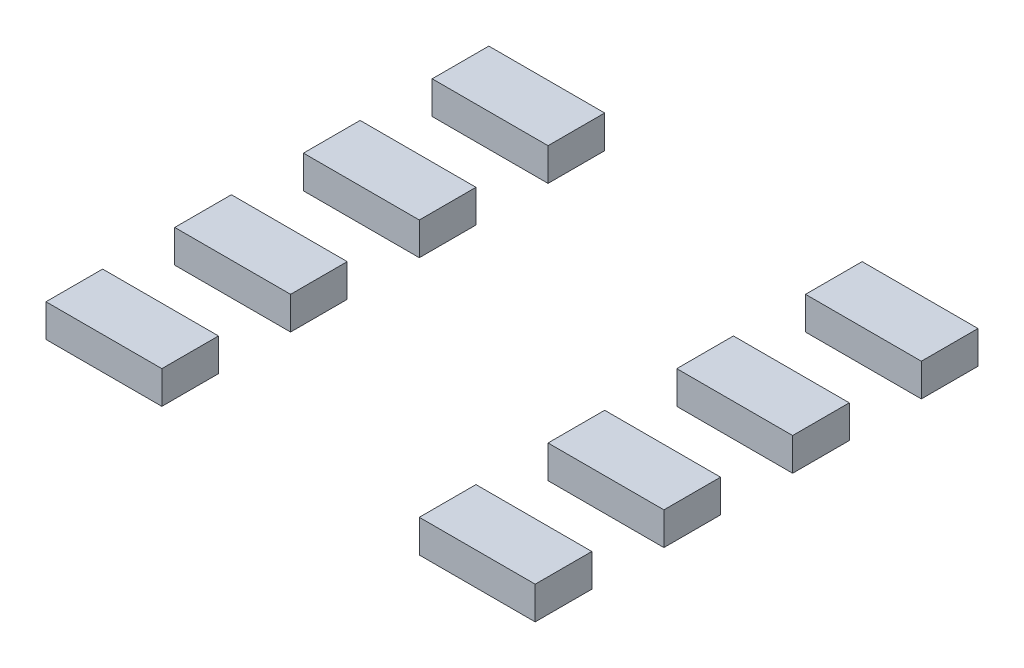
ISO-10303-21;
HEADER;
FILE_DESCRIPTION(('STEP AP214'),'2;1');
FILE_NAME('part.step','',(''),(''),'','','');
FILE_SCHEMA(('AUTOMOTIVE_DESIGN { 1 0 10303 214 1 1 1 1 }'));
ENDSEC;
DATA;
#1=APPLICATION_CONTEXT('core data for automotive mechanical design processes');
#2=APPLICATION_PROTOCOL_DEFINITION('international standard','automotive_design',2000,#1);
#3=PRODUCT_CONTEXT('',#1,'mechanical');
#4=PRODUCT('Part','Part','',(#3));
#5=PRODUCT_RELATED_PRODUCT_CATEGORY('part','',(#4));
#6=PRODUCT_DEFINITION_FORMATION('','',#4);
#7=PRODUCT_DEFINITION_CONTEXT('part definition',#1,'design');
#8=PRODUCT_DEFINITION('design','',#6,#7);
#9=PRODUCT_DEFINITION_SHAPE('','',#8);
#10=(LENGTH_UNIT() NAMED_UNIT(*) SI_UNIT(.MILLI.,.METRE.));
#11=(NAMED_UNIT(*) PLANE_ANGLE_UNIT() SI_UNIT($,.RADIAN.));
#12=(NAMED_UNIT(*) SI_UNIT($,.STERADIAN.) SOLID_ANGLE_UNIT());
#13=UNCERTAINTY_MEASURE_WITH_UNIT(LENGTH_MEASURE(1.E-05),#10,'distance_accuracy_value','');
#14=(GEOMETRIC_REPRESENTATION_CONTEXT(3) GLOBAL_UNCERTAINTY_ASSIGNED_CONTEXT((#13)) GLOBAL_UNIT_ASSIGNED_CONTEXT((#10,
#11,#12)) REPRESENTATION_CONTEXT('',''));
#15=CARTESIAN_POINT('',(0.,0.,0.));
#16=DIRECTION('',(0.,0.,1.));
#17=DIRECTION('',(1.,0.,0.));
#18=AXIS2_PLACEMENT_3D('',#15,#16,#17);
#19=CARTESIAN_POINT('',(0.,0.127,0.));
#20=DIRECTION('',(0.,1.,0.));
#21=DIRECTION('',(1.,0.,0.));
#22=AXIS2_PLACEMENT_3D('',#19,#20,#21);
#23=PLANE('',#22);
#24=DIRECTION('',(1.,0.,0.));
#25=VECTOR('',#24,1.);
#26=CARTESIAN_POINT('',(-0.95,0.127,-0.64));
#27=LINE('',#26,#25);
#28=CARTESIAN_POINT('',(-0.95,0.127,-0.64));
#29=VERTEX_POINT('',#28);
#30=CARTESIAN_POINT('',(-0.5,0.127,-0.64));
#31=VERTEX_POINT('',#30);
#32=EDGE_CURVE('P0_E11',#29,#31,#27,.T.);
#33=ORIENTED_EDGE('',*,*,#32,.T.);
#34=DIRECTION('',(0.,0.,-1.));
#35=VECTOR('',#34,1.);
#36=CARTESIAN_POINT('',(-0.5,0.127,-0.64));
#37=LINE('',#36,#35);
#38=CARTESIAN_POINT('',(-0.5,0.127,-0.86));
#39=VERTEX_POINT('',#38);
#40=EDGE_CURVE('P0_E81',#31,#39,#37,.T.);
#41=ORIENTED_EDGE('',*,*,#40,.T.);
#42=DIRECTION('',(-1.,0.,0.));
#43=VECTOR('',#42,1.);
#44=CARTESIAN_POINT('',(-0.5,0.127,-0.86));
#45=LINE('',#44,#43);
#46=CARTESIAN_POINT('',(-0.95,0.127,-0.86));
#47=VERTEX_POINT('',#46);
#48=EDGE_CURVE('P0_E78',#39,#47,#45,.T.);
#49=ORIENTED_EDGE('',*,*,#48,.T.);
#50=DIRECTION('',(0.,0.,1.));
#51=VECTOR('',#50,1.);
#52=CARTESIAN_POINT('',(-0.95,0.127,-0.86));
#53=LINE('',#52,#51);
#54=EDGE_CURVE('P0_E79',#47,#29,#53,.T.);
#55=ORIENTED_EDGE('',*,*,#54,.T.);
#56=EDGE_LOOP('',(#33,#41,#49,#55));
#57=FACE_BOUND('',#56,.T.);
#58=ADVANCED_FACE('P0_F18',(#57),#23,.T.);
#59=CARTESIAN_POINT('',(-0.95,0.,-0.64));
#60=DIRECTION('',(0.,0.,1.));
#61=DIRECTION('',(1.,0.,0.));
#62=AXIS2_PLACEMENT_3D('',#59,#60,#61);
#63=PLANE('',#62);
#64=DIRECTION('',(0.,1.,0.));
#65=VECTOR('',#64,1.);
#66=CARTESIAN_POINT('',(-0.5,0.,-0.64));
#67=LINE('',#66,#65);
#68=CARTESIAN_POINT('',(-0.5,0.,-0.64));
#69=VERTEX_POINT('',#68);
#70=EDGE_CURVE('P0_E27',#69,#31,#67,.T.);
#71=ORIENTED_EDGE('',*,*,#70,.T.);
#72=ORIENTED_EDGE('',*,*,#32,.F.);
#73=DIRECTION('',(0.,1.,0.));
#74=VECTOR('',#73,1.);
#75=CARTESIAN_POINT('',(-0.95,0.,-0.64));
#76=LINE('',#75,#74);
#77=CARTESIAN_POINT('',(-0.95,0.,-0.64));
#78=VERTEX_POINT('',#77);
#79=EDGE_CURVE('P0_E94',#78,#29,#76,.T.);
#80=ORIENTED_EDGE('',*,*,#79,.F.);
#81=DIRECTION('',(1.,0.,0.));
#82=VECTOR('',#81,1.);
#83=CARTESIAN_POINT('',(-0.95,0.,-0.64));
#84=LINE('',#83,#82);
#85=EDGE_CURVE('P0_E113',#78,#69,#84,.T.);
#86=ORIENTED_EDGE('',*,*,#85,.T.);
#87=EDGE_LOOP('',(#71,#72,#80,#86));
#88=FACE_BOUND('',#87,.T.);
#89=ADVANCED_FACE('P0_F119',(#88),#63,.T.);
#90=CARTESIAN_POINT('',(-0.5,0.,-0.64));
#91=DIRECTION('',(1.,0.,0.));
#92=DIRECTION('',(0.,1.,0.));
#93=AXIS2_PLACEMENT_3D('',#90,#91,#92);
#94=PLANE('',#93);
#95=DIRECTION('',(0.,1.,0.));
#96=VECTOR('',#95,1.);
#97=CARTESIAN_POINT('',(-0.5,0.,-0.86));
#98=LINE('',#97,#96);
#99=CARTESIAN_POINT('',(-0.5,0.,-0.86));
#100=VERTEX_POINT('',#99);
#101=EDGE_CURVE('P0_E85',#100,#39,#98,.T.);
#102=ORIENTED_EDGE('',*,*,#101,.T.);
#103=ORIENTED_EDGE('',*,*,#40,.F.);
#104=ORIENTED_EDGE('',*,*,#70,.F.);
#105=DIRECTION('',(0.,0.,-1.));
#106=VECTOR('',#105,1.);
#107=CARTESIAN_POINT('',(-0.5,0.,-0.64));
#108=LINE('',#107,#106);
#109=EDGE_CURVE('P0_E110',#69,#100,#108,.T.);
#110=ORIENTED_EDGE('',*,*,#109,.T.);
#111=EDGE_LOOP('',(#102,#103,#104,#110));
#112=FACE_BOUND('',#111,.T.);
#113=ADVANCED_FACE('P0_F122',(#112),#94,.T.);
#114=CARTESIAN_POINT('',(-0.5,0.,-0.86));
#115=DIRECTION('',(0.,0.,-1.));
#116=DIRECTION('',(0.,-1.,0.));
#117=AXIS2_PLACEMENT_3D('',#114,#115,#116);
#118=PLANE('',#117);
#119=DIRECTION('',(0.,1.,0.));
#120=VECTOR('',#119,1.);
#121=CARTESIAN_POINT('',(-0.95,0.,-0.86));
#122=LINE('',#121,#120);
#123=CARTESIAN_POINT('',(-0.95,0.,-0.86));
#124=VERTEX_POINT('',#123);
#125=EDGE_CURVE('P0_E65',#124,#47,#122,.T.);
#126=ORIENTED_EDGE('',*,*,#125,.T.);
#127=ORIENTED_EDGE('',*,*,#48,.F.);
#128=ORIENTED_EDGE('',*,*,#101,.F.);
#129=DIRECTION('',(-1.,0.,0.));
#130=VECTOR('',#129,1.);
#131=CARTESIAN_POINT('',(-0.5,0.,-0.86));
#132=LINE('',#131,#130);
#133=EDGE_CURVE('P0_E90',#100,#124,#132,.T.);
#134=ORIENTED_EDGE('',*,*,#133,.T.);
#135=EDGE_LOOP('',(#126,#127,#128,#134));
#136=FACE_BOUND('',#135,.T.);
#137=ADVANCED_FACE('P0_F88',(#136),#118,.T.);
#138=CARTESIAN_POINT('',(-0.95,0.,-0.86));
#139=DIRECTION('',(-1.,0.,0.));
#140=DIRECTION('',(0.,0.,1.));
#141=AXIS2_PLACEMENT_3D('',#138,#139,#140);
#142=PLANE('',#141);
#143=ORIENTED_EDGE('',*,*,#79,.T.);
#144=ORIENTED_EDGE('',*,*,#54,.F.);
#145=ORIENTED_EDGE('',*,*,#125,.F.);
#146=DIRECTION('',(0.,0.,1.));
#147=VECTOR('',#146,1.);
#148=CARTESIAN_POINT('',(-0.95,0.,-0.86));
#149=LINE('',#148,#147);
#150=EDGE_CURVE('P0_E100',#124,#78,#149,.T.);
#151=ORIENTED_EDGE('',*,*,#150,.T.);
#152=EDGE_LOOP('',(#143,#144,#145,#151));
#153=FACE_BOUND('',#152,.T.);
#154=ADVANCED_FACE('P0_F93',(#153),#142,.T.);
#155=CARTESIAN_POINT('',(0.,0.,0.));
#156=DIRECTION('',(0.,1.,0.));
#157=DIRECTION('',(1.,0.,0.));
#158=AXIS2_PLACEMENT_3D('',#155,#156,#157);
#159=PLANE('',#158);
#160=ORIENTED_EDGE('',*,*,#133,.F.);
#161=ORIENTED_EDGE('',*,*,#109,.F.);
#162=ORIENTED_EDGE('',*,*,#85,.F.);
#163=ORIENTED_EDGE('',*,*,#150,.F.);
#164=EDGE_LOOP('',(#160,#161,#162,#163));
#165=FACE_BOUND('',#164,.T.);
#166=ADVANCED_FACE('P0_F121',(#165),#159,.F.);
#167=CLOSED_SHELL('',(#58,#89,#113,#137,#154,#166));
#168=MANIFOLD_SOLID_BREP('P0_B1',#167);
#169=CARTESIAN_POINT('',(0.,0.127,0.));
#170=DIRECTION('',(0.,1.,0.));
#171=DIRECTION('',(1.,0.,0.));
#172=AXIS2_PLACEMENT_3D('',#169,#170,#171);
#173=PLANE('',#172);
#174=DIRECTION('',(1.,0.,0.));
#175=VECTOR('',#174,1.);
#176=CARTESIAN_POINT('',(-0.95,0.127,-0.14));
#177=LINE('',#176,#175);
#178=CARTESIAN_POINT('',(-0.95,0.127,-0.14));
#179=VERTEX_POINT('',#178);
#180=CARTESIAN_POINT('',(-0.5,0.127,-0.14));
#181=VERTEX_POINT('',#180);
#182=EDGE_CURVE('P1_E11',#179,#181,#177,.T.);
#183=ORIENTED_EDGE('',*,*,#182,.T.);
#184=DIRECTION('',(0.,0.,-1.));
#185=VECTOR('',#184,1.);
#186=CARTESIAN_POINT('',(-0.5,0.127,-0.14));
#187=LINE('',#186,#185);
#188=CARTESIAN_POINT('',(-0.5,0.127,-0.36));
#189=VERTEX_POINT('',#188);
#190=EDGE_CURVE('P1_E84',#181,#189,#187,.T.);
#191=ORIENTED_EDGE('',*,*,#190,.T.);
#192=DIRECTION('',(-1.,0.,0.));
#193=VECTOR('',#192,1.);
#194=CARTESIAN_POINT('',(-0.5,0.127,-0.36));
#195=LINE('',#194,#193);
#196=CARTESIAN_POINT('',(-0.95,0.127,-0.36));
#197=VERTEX_POINT('',#196);
#198=EDGE_CURVE('P1_E80',#189,#197,#195,.T.);
#199=ORIENTED_EDGE('',*,*,#198,.T.);
#200=DIRECTION('',(0.,0.,1.));
#201=VECTOR('',#200,1.);
#202=CARTESIAN_POINT('',(-0.95,0.127,-0.36));
#203=LINE('',#202,#201);
#204=EDGE_CURVE('P1_E109',#197,#179,#203,.T.);
#205=ORIENTED_EDGE('',*,*,#204,.T.);
#206=EDGE_LOOP('',(#183,#191,#199,#205));
#207=FACE_BOUND('',#206,.T.);
#208=ADVANCED_FACE('P1_F18',(#207),#173,.T.);
#209=CARTESIAN_POINT('',(-0.95,0.,-0.14));
#210=DIRECTION('',(0.,0.,1.));
#211=DIRECTION('',(1.,0.,0.));
#212=AXIS2_PLACEMENT_3D('',#209,#210,#211);
#213=PLANE('',#212);
#214=DIRECTION('',(0.,1.,0.));
#215=VECTOR('',#214,1.);
#216=CARTESIAN_POINT('',(-0.5,0.,-0.14));
#217=LINE('',#216,#215);
#218=CARTESIAN_POINT('',(-0.5,0.,-0.14));
#219=VERTEX_POINT('',#218);
#220=EDGE_CURVE('P1_E28',#219,#181,#217,.T.);
#221=ORIENTED_EDGE('',*,*,#220,.T.);
#222=ORIENTED_EDGE('',*,*,#182,.F.);
#223=DIRECTION('',(0.,1.,0.));
#224=VECTOR('',#223,1.);
#225=CARTESIAN_POINT('',(-0.95,0.,-0.14));
#226=LINE('',#225,#224);
#227=CARTESIAN_POINT('',(-0.95,0.,-0.14));
#228=VERTEX_POINT('',#227);
#229=EDGE_CURVE('P1_E56',#228,#179,#226,.T.);
#230=ORIENTED_EDGE('',*,*,#229,.F.);
#231=DIRECTION('',(1.,0.,0.));
#232=VECTOR('',#231,1.);
#233=CARTESIAN_POINT('',(-0.95,0.,-0.14));
#234=LINE('',#233,#232);
#235=EDGE_CURVE('P1_E90',#228,#219,#234,.T.);
#236=ORIENTED_EDGE('',*,*,#235,.T.);
#237=EDGE_LOOP('',(#221,#222,#230,#236));
#238=FACE_BOUND('',#237,.T.);
#239=ADVANCED_FACE('P1_F116',(#238),#213,.T.);
#240=CARTESIAN_POINT('',(-0.5,0.,-0.14));
#241=DIRECTION('',(1.,0.,0.));
#242=DIRECTION('',(0.,1.,0.));
#243=AXIS2_PLACEMENT_3D('',#240,#241,#242);
#244=PLANE('',#243);
#245=DIRECTION('',(0.,1.,0.));
#246=VECTOR('',#245,1.);
#247=CARTESIAN_POINT('',(-0.5,0.,-0.36));
#248=LINE('',#247,#246);
#249=CARTESIAN_POINT('',(-0.5,0.,-0.36));
#250=VERTEX_POINT('',#249);
#251=EDGE_CURVE('P1_E74',#250,#189,#248,.T.);
#252=ORIENTED_EDGE('',*,*,#251,.T.);
#253=ORIENTED_EDGE('',*,*,#190,.F.);
#254=ORIENTED_EDGE('',*,*,#220,.F.);
#255=DIRECTION('',(0.,0.,-1.));
#256=VECTOR('',#255,1.);
#257=CARTESIAN_POINT('',(-0.5,0.,-0.14));
#258=LINE('',#257,#256);
#259=EDGE_CURVE('P1_E86',#219,#250,#258,.T.);
#260=ORIENTED_EDGE('',*,*,#259,.T.);
#261=EDGE_LOOP('',(#252,#253,#254,#260));
#262=FACE_BOUND('',#261,.T.);
#263=ADVANCED_FACE('P1_F20',(#262),#244,.T.);
#264=CARTESIAN_POINT('',(-0.5,0.,-0.36));
#265=DIRECTION('',(0.,0.,-1.));
#266=DIRECTION('',(0.,-1.,0.));
#267=AXIS2_PLACEMENT_3D('',#264,#265,#266);
#268=PLANE('',#267);
#269=DIRECTION('',(0.,1.,0.));
#270=VECTOR('',#269,1.);
#271=CARTESIAN_POINT('',(-0.95,0.,-0.36));
#272=LINE('',#271,#270);
#273=CARTESIAN_POINT('',(-0.95,0.,-0.36));
#274=VERTEX_POINT('',#273);
#275=EDGE_CURVE('P1_E108',#274,#197,#272,.T.);
#276=ORIENTED_EDGE('',*,*,#275,.T.);
#277=ORIENTED_EDGE('',*,*,#198,.F.);
#278=ORIENTED_EDGE('',*,*,#251,.F.);
#279=DIRECTION('',(-1.,0.,0.));
#280=VECTOR('',#279,1.);
#281=CARTESIAN_POINT('',(-0.5,0.,-0.36));
#282=LINE('',#281,#280);
#283=EDGE_CURVE('P1_E79',#250,#274,#282,.T.);
#284=ORIENTED_EDGE('',*,*,#283,.T.);
#285=EDGE_LOOP('',(#276,#277,#278,#284));
#286=FACE_BOUND('',#285,.T.);
#287=ADVANCED_FACE('P1_F77',(#286),#268,.T.);
#288=CARTESIAN_POINT('',(-0.95,0.,-0.36));
#289=DIRECTION('',(-1.,0.,0.));
#290=DIRECTION('',(0.,0.,1.));
#291=AXIS2_PLACEMENT_3D('',#288,#289,#290);
#292=PLANE('',#291);
#293=ORIENTED_EDGE('',*,*,#229,.T.);
#294=ORIENTED_EDGE('',*,*,#204,.F.);
#295=ORIENTED_EDGE('',*,*,#275,.F.);
#296=DIRECTION('',(0.,0.,1.));
#297=VECTOR('',#296,1.);
#298=CARTESIAN_POINT('',(-0.95,0.,-0.36));
#299=LINE('',#298,#297);
#300=EDGE_CURVE('P1_E94',#274,#228,#299,.T.);
#301=ORIENTED_EDGE('',*,*,#300,.T.);
#302=EDGE_LOOP('',(#293,#294,#295,#301));
#303=FACE_BOUND('',#302,.T.);
#304=ADVANCED_FACE('P1_F120',(#303),#292,.T.);
#305=CARTESIAN_POINT('',(0.,0.,0.));
#306=DIRECTION('',(0.,1.,0.));
#307=DIRECTION('',(1.,0.,0.));
#308=AXIS2_PLACEMENT_3D('',#305,#306,#307);
#309=PLANE('',#308);
#310=ORIENTED_EDGE('',*,*,#283,.F.);
#311=ORIENTED_EDGE('',*,*,#259,.F.);
#312=ORIENTED_EDGE('',*,*,#235,.F.);
#313=ORIENTED_EDGE('',*,*,#300,.F.);
#314=EDGE_LOOP('',(#310,#311,#312,#313));
#315=FACE_BOUND('',#314,.T.);
#316=ADVANCED_FACE('P1_F93',(#315),#309,.F.);
#317=CLOSED_SHELL('',(#208,#239,#263,#287,#304,#316));
#318=MANIFOLD_SOLID_BREP('P1_B1',#317);
#319=CARTESIAN_POINT('',(0.,0.127,0.));
#320=DIRECTION('',(0.,1.,0.));
#321=DIRECTION('',(1.,0.,0.));
#322=AXIS2_PLACEMENT_3D('',#319,#320,#321);
#323=PLANE('',#322);
#324=DIRECTION('',(1.,0.,0.));
#325=VECTOR('',#324,1.);
#326=CARTESIAN_POINT('',(-0.95,0.127,0.36));
#327=LINE('',#326,#325);
#328=CARTESIAN_POINT('',(-0.95,0.127,0.36));
#329=VERTEX_POINT('',#328);
#330=CARTESIAN_POINT('',(-0.5,0.127,0.36));
#331=VERTEX_POINT('',#330);
#332=EDGE_CURVE('P2_E11',#329,#331,#327,.T.);
#333=ORIENTED_EDGE('',*,*,#332,.T.);
#334=DIRECTION('',(0.,0.,-1.));
#335=VECTOR('',#334,1.);
#336=CARTESIAN_POINT('',(-0.5,0.127,0.36));
#337=LINE('',#336,#335);
#338=CARTESIAN_POINT('',(-0.5,0.127,0.14));
#339=VERTEX_POINT('',#338);
#340=EDGE_CURVE('P2_E102',#331,#339,#337,.T.);
#341=ORIENTED_EDGE('',*,*,#340,.T.);
#342=DIRECTION('',(-1.,0.,0.));
#343=VECTOR('',#342,1.);
#344=CARTESIAN_POINT('',(-0.5,0.127,0.14));
#345=LINE('',#344,#343);
#346=CARTESIAN_POINT('',(-0.95,0.127,0.14));
#347=VERTEX_POINT('',#346);
#348=EDGE_CURVE('P2_E80',#339,#347,#345,.T.);
#349=ORIENTED_EDGE('',*,*,#348,.T.);
#350=DIRECTION('',(0.,0.,1.));
#351=VECTOR('',#350,1.);
#352=CARTESIAN_POINT('',(-0.95,0.127,0.14));
#353=LINE('',#352,#351);
#354=EDGE_CURVE('P2_E78',#347,#329,#353,.T.);
#355=ORIENTED_EDGE('',*,*,#354,.T.);
#356=EDGE_LOOP('',(#333,#341,#349,#355));
#357=FACE_BOUND('',#356,.T.);
#358=ADVANCED_FACE('P2_F18',(#357),#323,.T.);
#359=CARTESIAN_POINT('',(-0.95,0.,0.36));
#360=DIRECTION('',(0.,0.,1.));
#361=DIRECTION('',(1.,0.,0.));
#362=AXIS2_PLACEMENT_3D('',#359,#360,#361);
#363=PLANE('',#362);
#364=DIRECTION('',(0.,1.,0.));
#365=VECTOR('',#364,1.);
#366=CARTESIAN_POINT('',(-0.5,0.,0.36));
#367=LINE('',#366,#365);
#368=CARTESIAN_POINT('',(-0.5,0.,0.36));
#369=VERTEX_POINT('',#368);
#370=EDGE_CURVE('P2_E28',#369,#331,#367,.T.);
#371=ORIENTED_EDGE('',*,*,#370,.T.);
#372=ORIENTED_EDGE('',*,*,#332,.F.);
#373=DIRECTION('',(0.,1.,0.));
#374=VECTOR('',#373,1.);
#375=CARTESIAN_POINT('',(-0.95,0.,0.36));
#376=LINE('',#375,#374);
#377=CARTESIAN_POINT('',(-0.95,0.,0.36));
#378=VERTEX_POINT('',#377);
#379=EDGE_CURVE('P2_E89',#378,#329,#376,.T.);
#380=ORIENTED_EDGE('',*,*,#379,.F.);
#381=DIRECTION('',(1.,0.,0.));
#382=VECTOR('',#381,1.);
#383=CARTESIAN_POINT('',(-0.95,0.,0.36));
#384=LINE('',#383,#382);
#385=EDGE_CURVE('P2_E87',#378,#369,#384,.T.);
#386=ORIENTED_EDGE('',*,*,#385,.T.);
#387=EDGE_LOOP('',(#371,#372,#380,#386));
#388=FACE_BOUND('',#387,.T.);
#389=ADVANCED_FACE('P2_F118',(#388),#363,.T.);
#390=CARTESIAN_POINT('',(-0.5,0.,0.36));
#391=DIRECTION('',(1.,0.,0.));
#392=DIRECTION('',(0.,1.,0.));
#393=AXIS2_PLACEMENT_3D('',#390,#391,#392);
#394=PLANE('',#393);
#395=DIRECTION('',(0.,1.,0.));
#396=VECTOR('',#395,1.);
#397=CARTESIAN_POINT('',(-0.5,0.,0.14));
#398=LINE('',#397,#396);
#399=CARTESIAN_POINT('',(-0.5,0.,0.14));
#400=VERTEX_POINT('',#399);
#401=EDGE_CURVE('P2_E63',#400,#339,#398,.T.);
#402=ORIENTED_EDGE('',*,*,#401,.T.);
#403=ORIENTED_EDGE('',*,*,#340,.F.);
#404=ORIENTED_EDGE('',*,*,#370,.F.);
#405=DIRECTION('',(0.,0.,-1.));
#406=VECTOR('',#405,1.);
#407=CARTESIAN_POINT('',(-0.5,0.,0.36));
#408=LINE('',#407,#406);
#409=EDGE_CURVE('P2_E93',#369,#400,#408,.T.);
#410=ORIENTED_EDGE('',*,*,#409,.T.);
#411=EDGE_LOOP('',(#402,#403,#404,#410));
#412=FACE_BOUND('',#411,.T.);
#413=ADVANCED_FACE('P2_F115',(#412),#394,.T.);
#414=CARTESIAN_POINT('',(-0.5,0.,0.14));
#415=DIRECTION('',(0.,0.,-1.));
#416=DIRECTION('',(0.,-1.,0.));
#417=AXIS2_PLACEMENT_3D('',#414,#415,#416);
#418=PLANE('',#417);
#419=DIRECTION('',(0.,1.,0.));
#420=VECTOR('',#419,1.);
#421=CARTESIAN_POINT('',(-0.95,0.,0.14));
#422=LINE('',#421,#420);
#423=CARTESIAN_POINT('',(-0.95,0.,0.14));
#424=VERTEX_POINT('',#423);
#425=EDGE_CURVE('P2_E21',#424,#347,#422,.T.);
#426=ORIENTED_EDGE('',*,*,#425,.T.);
#427=ORIENTED_EDGE('',*,*,#348,.F.);
#428=ORIENTED_EDGE('',*,*,#401,.F.);
#429=DIRECTION('',(-1.,0.,0.));
#430=VECTOR('',#429,1.);
#431=CARTESIAN_POINT('',(-0.5,0.,0.14));
#432=LINE('',#431,#430);
#433=EDGE_CURVE('P2_E85',#400,#424,#432,.T.);
#434=ORIENTED_EDGE('',*,*,#433,.T.);
#435=EDGE_LOOP('',(#426,#427,#428,#434));
#436=FACE_BOUND('',#435,.T.);
#437=ADVANCED_FACE('P2_F91',(#436),#418,.T.);
#438=CARTESIAN_POINT('',(-0.95,0.,0.14));
#439=DIRECTION('',(-1.,0.,0.));
#440=DIRECTION('',(0.,0.,1.));
#441=AXIS2_PLACEMENT_3D('',#438,#439,#440);
#442=PLANE('',#441);
#443=ORIENTED_EDGE('',*,*,#379,.T.);
#444=ORIENTED_EDGE('',*,*,#354,.F.);
#445=ORIENTED_EDGE('',*,*,#425,.F.);
#446=DIRECTION('',(0.,0.,1.));
#447=VECTOR('',#446,1.);
#448=CARTESIAN_POINT('',(-0.95,0.,0.14));
#449=LINE('',#448,#447);
#450=EDGE_CURVE('P2_E76',#424,#378,#449,.T.);
#451=ORIENTED_EDGE('',*,*,#450,.T.);
#452=EDGE_LOOP('',(#443,#444,#445,#451));
#453=FACE_BOUND('',#452,.T.);
#454=ADVANCED_FACE('P2_F75',(#453),#442,.T.);
#455=CARTESIAN_POINT('',(0.,0.,0.));
#456=DIRECTION('',(0.,1.,0.));
#457=DIRECTION('',(1.,0.,0.));
#458=AXIS2_PLACEMENT_3D('',#455,#456,#457);
#459=PLANE('',#458);
#460=ORIENTED_EDGE('',*,*,#433,.F.);
#461=ORIENTED_EDGE('',*,*,#409,.F.);
#462=ORIENTED_EDGE('',*,*,#385,.F.);
#463=ORIENTED_EDGE('',*,*,#450,.F.);
#464=EDGE_LOOP('',(#460,#461,#462,#463));
#465=FACE_BOUND('',#464,.T.);
#466=ADVANCED_FACE('P2_F83',(#465),#459,.F.);
#467=CLOSED_SHELL('',(#358,#389,#413,#437,#454,#466));
#468=MANIFOLD_SOLID_BREP('P2_B1',#467);
#469=CARTESIAN_POINT('',(0.,0.127,0.));
#470=DIRECTION('',(0.,1.,0.));
#471=DIRECTION('',(1.,0.,0.));
#472=AXIS2_PLACEMENT_3D('',#469,#470,#471);
#473=PLANE('',#472);
#474=DIRECTION('',(1.,0.,0.));
#475=VECTOR('',#474,1.);
#476=CARTESIAN_POINT('',(-0.95,0.127,0.86));
#477=LINE('',#476,#475);
#478=CARTESIAN_POINT('',(-0.95,0.127,0.86));
#479=VERTEX_POINT('',#478);
#480=CARTESIAN_POINT('',(-0.5,0.127,0.86));
#481=VERTEX_POINT('',#480);
#482=EDGE_CURVE('P3_E11',#479,#481,#477,.T.);
#483=ORIENTED_EDGE('',*,*,#482,.T.);
#484=DIRECTION('',(0.,0.,-1.));
#485=VECTOR('',#484,1.);
#486=CARTESIAN_POINT('',(-0.5,0.127,0.86));
#487=LINE('',#486,#485);
#488=CARTESIAN_POINT('',(-0.5,0.127,0.64));
#489=VERTEX_POINT('',#488);
#490=EDGE_CURVE('P3_E48',#481,#489,#487,.T.);
#491=ORIENTED_EDGE('',*,*,#490,.T.);
#492=DIRECTION('',(-1.,0.,0.));
#493=VECTOR('',#492,1.);
#494=CARTESIAN_POINT('',(-0.5,0.127,0.64));
#495=LINE('',#494,#493);
#496=CARTESIAN_POINT('',(-0.95,0.127,0.64));
#497=VERTEX_POINT('',#496);
#498=EDGE_CURVE('P3_E89',#489,#497,#495,.T.);
#499=ORIENTED_EDGE('',*,*,#498,.T.);
#500=DIRECTION('',(0.,0.,1.));
#501=VECTOR('',#500,1.);
#502=CARTESIAN_POINT('',(-0.95,0.127,0.64));
#503=LINE('',#502,#501);
#504=EDGE_CURVE('P3_E88',#497,#479,#503,.T.);
#505=ORIENTED_EDGE('',*,*,#504,.T.);
#506=EDGE_LOOP('',(#483,#491,#499,#505));
#507=FACE_BOUND('',#506,.T.);
#508=ADVANCED_FACE('P3_F18',(#507),#473,.T.);
#509=CARTESIAN_POINT('',(-0.95,0.,0.86));
#510=DIRECTION('',(0.,0.,1.));
#511=DIRECTION('',(1.,0.,0.));
#512=AXIS2_PLACEMENT_3D('',#509,#510,#511);
#513=PLANE('',#512);
#514=DIRECTION('',(0.,1.,0.));
#515=VECTOR('',#514,1.);
#516=CARTESIAN_POINT('',(-0.5,0.,0.86));
#517=LINE('',#516,#515);
#518=CARTESIAN_POINT('',(-0.5,0.,0.86));
#519=VERTEX_POINT('',#518);
#520=EDGE_CURVE('P3_E28',#519,#481,#517,.T.);
#521=ORIENTED_EDGE('',*,*,#520,.T.);
#522=ORIENTED_EDGE('',*,*,#482,.F.);
#523=DIRECTION('',(0.,1.,0.));
#524=VECTOR('',#523,1.);
#525=CARTESIAN_POINT('',(-0.95,0.,0.86));
#526=LINE('',#525,#524);
#527=CARTESIAN_POINT('',(-0.95,0.,0.86));
#528=VERTEX_POINT('',#527);
#529=EDGE_CURVE('P3_E86',#528,#479,#526,.T.);
#530=ORIENTED_EDGE('',*,*,#529,.F.);
#531=DIRECTION('',(1.,0.,0.));
#532=VECTOR('',#531,1.);
#533=CARTESIAN_POINT('',(-0.95,0.,0.86));
#534=LINE('',#533,#532);
#535=EDGE_CURVE('P3_E22',#528,#519,#534,.T.);
#536=ORIENTED_EDGE('',*,*,#535,.T.);
#537=EDGE_LOOP('',(#521,#522,#530,#536));
#538=FACE_BOUND('',#537,.T.);
#539=ADVANCED_FACE('P3_F20',(#538),#513,.T.);
#540=CARTESIAN_POINT('',(-0.5,0.,0.86));
#541=DIRECTION('',(1.,0.,0.));
#542=DIRECTION('',(0.,1.,0.));
#543=AXIS2_PLACEMENT_3D('',#540,#541,#542);
#544=PLANE('',#543);
#545=DIRECTION('',(0.,1.,0.));
#546=VECTOR('',#545,1.);
#547=CARTESIAN_POINT('',(-0.5,0.,0.64));
#548=LINE('',#547,#546);
#549=CARTESIAN_POINT('',(-0.5,0.,0.64));
#550=VERTEX_POINT('',#549);
#551=EDGE_CURVE('P3_E61',#550,#489,#548,.T.);
#552=ORIENTED_EDGE('',*,*,#551,.T.);
#553=ORIENTED_EDGE('',*,*,#490,.F.);
#554=ORIENTED_EDGE('',*,*,#520,.F.);
#555=DIRECTION('',(0.,0.,-1.));
#556=VECTOR('',#555,1.);
#557=CARTESIAN_POINT('',(-0.5,0.,0.86));
#558=LINE('',#557,#556);
#559=EDGE_CURVE('P3_E111',#519,#550,#558,.T.);
#560=ORIENTED_EDGE('',*,*,#559,.T.);
#561=EDGE_LOOP('',(#552,#553,#554,#560));
#562=FACE_BOUND('',#561,.T.);
#563=ADVANCED_FACE('P3_F132',(#562),#544,.T.);
#564=CARTESIAN_POINT('',(-0.5,0.,0.64));
#565=DIRECTION('',(0.,0.,-1.));
#566=DIRECTION('',(0.,-1.,0.));
#567=AXIS2_PLACEMENT_3D('',#564,#565,#566);
#568=PLANE('',#567);
#569=DIRECTION('',(0.,1.,0.));
#570=VECTOR('',#569,1.);
#571=CARTESIAN_POINT('',(-0.95,0.,0.64));
#572=LINE('',#571,#570);
#573=CARTESIAN_POINT('',(-0.95,0.,0.64));
#574=VERTEX_POINT('',#573);
#575=EDGE_CURVE('P3_E74',#574,#497,#572,.T.);
#576=ORIENTED_EDGE('',*,*,#575,.T.);
#577=ORIENTED_EDGE('',*,*,#498,.F.);
#578=ORIENTED_EDGE('',*,*,#551,.F.);
#579=DIRECTION('',(-1.,0.,0.));
#580=VECTOR('',#579,1.);
#581=CARTESIAN_POINT('',(-0.5,0.,0.64));
#582=LINE('',#581,#580);
#583=EDGE_CURVE('P3_E114',#550,#574,#582,.T.);
#584=ORIENTED_EDGE('',*,*,#583,.T.);
#585=EDGE_LOOP('',(#576,#577,#578,#584));
#586=FACE_BOUND('',#585,.T.);
#587=ADVANCED_FACE('P3_F120',(#586),#568,.T.);
#588=CARTESIAN_POINT('',(-0.95,0.,0.64));
#589=DIRECTION('',(-1.,0.,0.));
#590=DIRECTION('',(0.,0.,1.));
#591=AXIS2_PLACEMENT_3D('',#588,#589,#590);
#592=PLANE('',#591);
#593=ORIENTED_EDGE('',*,*,#529,.T.);
#594=ORIENTED_EDGE('',*,*,#504,.F.);
#595=ORIENTED_EDGE('',*,*,#575,.F.);
#596=DIRECTION('',(0.,0.,1.));
#597=VECTOR('',#596,1.);
#598=CARTESIAN_POINT('',(-0.95,0.,0.64));
#599=LINE('',#598,#597);
#600=EDGE_CURVE('P3_E93',#574,#528,#599,.T.);
#601=ORIENTED_EDGE('',*,*,#600,.T.);
#602=EDGE_LOOP('',(#593,#594,#595,#601));
#603=FACE_BOUND('',#602,.T.);
#604=ADVANCED_FACE('P3_F92',(#603),#592,.T.);
#605=CARTESIAN_POINT('',(0.,0.,0.));
#606=DIRECTION('',(0.,1.,0.));
#607=DIRECTION('',(1.,0.,0.));
#608=AXIS2_PLACEMENT_3D('',#605,#606,#607);
#609=PLANE('',#608);
#610=ORIENTED_EDGE('',*,*,#583,.F.);
#611=ORIENTED_EDGE('',*,*,#559,.F.);
#612=ORIENTED_EDGE('',*,*,#535,.F.);
#613=ORIENTED_EDGE('',*,*,#600,.F.);
#614=EDGE_LOOP('',(#610,#611,#612,#613));
#615=FACE_BOUND('',#614,.T.);
#616=ADVANCED_FACE('P3_F123',(#615),#609,.F.);
#617=CLOSED_SHELL('',(#508,#539,#563,#587,#604,#616));
#618=MANIFOLD_SOLID_BREP('P3_B1',#617);
#619=CARTESIAN_POINT('',(0.,0.127,0.));
#620=DIRECTION('',(0.,-1.,0.));
#621=DIRECTION('',(0.,0.,-1.));
#622=AXIS2_PLACEMENT_3D('',#619,#620,#621);
#623=PLANE('',#622);
#624=DIRECTION('',(1.,0.,0.));
#625=VECTOR('',#624,1.);
#626=CARTESIAN_POINT('',(0.5,0.127,-0.86));
#627=LINE('',#626,#625);
#628=CARTESIAN_POINT('',(0.5,0.127,-0.86));
#629=VERTEX_POINT('',#628);
#630=CARTESIAN_POINT('',(0.95,0.127,-0.86));
#631=VERTEX_POINT('',#630);
#632=EDGE_CURVE('P4_E11',#629,#631,#627,.T.);
#633=ORIENTED_EDGE('',*,*,#632,.F.);
#634=DIRECTION('',(0.,0.,-1.));
#635=VECTOR('',#634,1.);
#636=CARTESIAN_POINT('',(0.5,0.127,-0.64));
#637=LINE('',#636,#635);
#638=CARTESIAN_POINT('',(0.5,0.127,-0.64));
#639=VERTEX_POINT('',#638);
#640=EDGE_CURVE('P4_E73',#639,#629,#637,.T.);
#641=ORIENTED_EDGE('',*,*,#640,.F.);
#642=DIRECTION('',(-1.,0.,0.));
#643=VECTOR('',#642,1.);
#644=CARTESIAN_POINT('',(0.95,0.127,-0.64));
#645=LINE('',#644,#643);
#646=CARTESIAN_POINT('',(0.95,0.127,-0.64));
#647=VERTEX_POINT('',#646);
#648=EDGE_CURVE('P4_E107',#647,#639,#645,.T.);
#649=ORIENTED_EDGE('',*,*,#648,.F.);
#650=DIRECTION('',(0.,0.,1.));
#651=VECTOR('',#650,1.);
#652=CARTESIAN_POINT('',(0.95,0.127,-0.86));
#653=LINE('',#652,#651);
#654=EDGE_CURVE('P4_E99',#631,#647,#653,.T.);
#655=ORIENTED_EDGE('',*,*,#654,.F.);
#656=EDGE_LOOP('',(#633,#641,#649,#655));
#657=FACE_BOUND('',#656,.T.);
#658=ADVANCED_FACE('P4_F18',(#657),#623,.F.);
#659=CARTESIAN_POINT('',(0.5,0.,-0.86));
#660=DIRECTION('',(0.,0.,1.));
#661=DIRECTION('',(1.,0.,0.));
#662=AXIS2_PLACEMENT_3D('',#659,#660,#661);
#663=PLANE('',#662);
#664=DIRECTION('',(0.,1.,0.));
#665=VECTOR('',#664,1.);
#666=CARTESIAN_POINT('',(0.5,0.,-0.86));
#667=LINE('',#666,#665);
#668=CARTESIAN_POINT('',(0.5,0.,-0.86));
#669=VERTEX_POINT('',#668);
#670=EDGE_CURVE('P4_E29',#669,#629,#667,.T.);
#671=ORIENTED_EDGE('',*,*,#670,.T.);
#672=ORIENTED_EDGE('',*,*,#632,.T.);
#673=DIRECTION('',(0.,1.,0.));
#674=VECTOR('',#673,1.);
#675=CARTESIAN_POINT('',(0.95,0.,-0.86));
#676=LINE('',#675,#674);
#677=CARTESIAN_POINT('',(0.95,0.,-0.86));
#678=VERTEX_POINT('',#677);
#679=EDGE_CURVE('P4_E81',#678,#631,#676,.T.);
#680=ORIENTED_EDGE('',*,*,#679,.F.);
#681=DIRECTION('',(1.,0.,0.));
#682=VECTOR('',#681,1.);
#683=CARTESIAN_POINT('',(0.5,0.,-0.86));
#684=LINE('',#683,#682);
#685=EDGE_CURVE('P4_E78',#669,#678,#684,.T.);
#686=ORIENTED_EDGE('',*,*,#685,.F.);
#687=EDGE_LOOP('',(#671,#672,#680,#686));
#688=FACE_BOUND('',#687,.T.);
#689=ADVANCED_FACE('P4_F79',(#688),#663,.F.);
#690=CARTESIAN_POINT('',(0.5,0.,-0.64));
#691=DIRECTION('',(1.,0.,0.));
#692=DIRECTION('',(0.,1.,0.));
#693=AXIS2_PLACEMENT_3D('',#690,#691,#692);
#694=PLANE('',#693);
#695=DIRECTION('',(0.,1.,0.));
#696=VECTOR('',#695,1.);
#697=CARTESIAN_POINT('',(0.5,0.,-0.64));
#698=LINE('',#697,#696);
#699=CARTESIAN_POINT('',(0.5,0.,-0.64));
#700=VERTEX_POINT('',#699);
#701=EDGE_CURVE('P4_E105',#700,#639,#698,.T.);
#702=ORIENTED_EDGE('',*,*,#701,.T.);
#703=ORIENTED_EDGE('',*,*,#640,.T.);
#704=ORIENTED_EDGE('',*,*,#670,.F.);
#705=DIRECTION('',(0.,0.,-1.));
#706=VECTOR('',#705,1.);
#707=CARTESIAN_POINT('',(0.5,0.,-0.64));
#708=LINE('',#707,#706);
#709=EDGE_CURVE('P4_E71',#700,#669,#708,.T.);
#710=ORIENTED_EDGE('',*,*,#709,.F.);
#711=EDGE_LOOP('',(#702,#703,#704,#710));
#712=FACE_BOUND('',#711,.T.);
#713=ADVANCED_FACE('P4_F69',(#712),#694,.F.);
#714=CARTESIAN_POINT('',(0.95,0.,-0.64));
#715=DIRECTION('',(0.,0.,-1.));
#716=DIRECTION('',(0.,-1.,0.));
#717=AXIS2_PLACEMENT_3D('',#714,#715,#716);
#718=PLANE('',#717);
#719=DIRECTION('',(0.,1.,0.));
#720=VECTOR('',#719,1.);
#721=CARTESIAN_POINT('',(0.95,0.,-0.64));
#722=LINE('',#721,#720);
#723=CARTESIAN_POINT('',(0.95,0.,-0.64));
#724=VERTEX_POINT('',#723);
#725=EDGE_CURVE('P4_E97',#724,#647,#722,.T.);
#726=ORIENTED_EDGE('',*,*,#725,.T.);
#727=ORIENTED_EDGE('',*,*,#648,.T.);
#728=ORIENTED_EDGE('',*,*,#701,.F.);
#729=DIRECTION('',(-1.,0.,0.));
#730=VECTOR('',#729,1.);
#731=CARTESIAN_POINT('',(0.95,0.,-0.64));
#732=LINE('',#731,#730);
#733=EDGE_CURVE('P4_E22',#724,#700,#732,.T.);
#734=ORIENTED_EDGE('',*,*,#733,.F.);
#735=EDGE_LOOP('',(#726,#727,#728,#734));
#736=FACE_BOUND('',#735,.T.);
#737=ADVANCED_FACE('P4_F115',(#736),#718,.F.);
#738=CARTESIAN_POINT('',(0.95,0.,-0.86));
#739=DIRECTION('',(-1.,0.,0.));
#740=DIRECTION('',(0.,0.,1.));
#741=AXIS2_PLACEMENT_3D('',#738,#739,#740);
#742=PLANE('',#741);
#743=ORIENTED_EDGE('',*,*,#679,.T.);
#744=ORIENTED_EDGE('',*,*,#654,.T.);
#745=ORIENTED_EDGE('',*,*,#725,.F.);
#746=DIRECTION('',(0.,0.,1.));
#747=VECTOR('',#746,1.);
#748=CARTESIAN_POINT('',(0.95,0.,-0.86));
#749=LINE('',#748,#747);
#750=EDGE_CURVE('P4_E86',#678,#724,#749,.T.);
#751=ORIENTED_EDGE('',*,*,#750,.F.);
#752=EDGE_LOOP('',(#743,#744,#745,#751));
#753=FACE_BOUND('',#752,.T.);
#754=ADVANCED_FACE('P4_F117',(#753),#742,.F.);
#755=CARTESIAN_POINT('',(0.,0.,0.));
#756=DIRECTION('',(0.,-1.,0.));
#757=DIRECTION('',(0.,0.,-1.));
#758=AXIS2_PLACEMENT_3D('',#755,#756,#757);
#759=PLANE('',#758);
#760=ORIENTED_EDGE('',*,*,#733,.T.);
#761=ORIENTED_EDGE('',*,*,#709,.T.);
#762=ORIENTED_EDGE('',*,*,#685,.T.);
#763=ORIENTED_EDGE('',*,*,#750,.T.);
#764=EDGE_LOOP('',(#760,#761,#762,#763));
#765=FACE_BOUND('',#764,.T.);
#766=ADVANCED_FACE('P4_F20',(#765),#759,.T.);
#767=CLOSED_SHELL('',(#658,#689,#713,#737,#754,#766));
#768=MANIFOLD_SOLID_BREP('P4_B1',#767);
#769=CARTESIAN_POINT('',(0.,0.127,0.));
#770=DIRECTION('',(0.,-1.,0.));
#771=DIRECTION('',(0.,0.,-1.));
#772=AXIS2_PLACEMENT_3D('',#769,#770,#771);
#773=PLANE('',#772);
#774=DIRECTION('',(1.,0.,0.));
#775=VECTOR('',#774,1.);
#776=CARTESIAN_POINT('',(0.5,0.127,-0.36));
#777=LINE('',#776,#775);
#778=CARTESIAN_POINT('',(0.5,0.127,-0.36));
#779=VERTEX_POINT('',#778);
#780=CARTESIAN_POINT('',(0.95,0.127,-0.36));
#781=VERTEX_POINT('',#780);
#782=EDGE_CURVE('P5_E11',#779,#781,#777,.T.);
#783=ORIENTED_EDGE('',*,*,#782,.F.);
#784=DIRECTION('',(0.,0.,-1.));
#785=VECTOR('',#784,1.);
#786=CARTESIAN_POINT('',(0.5,0.127,-0.14));
#787=LINE('',#786,#785);
#788=CARTESIAN_POINT('',(0.5,0.127,-0.14));
#789=VERTEX_POINT('',#788);
#790=EDGE_CURVE('P5_E70',#789,#779,#787,.T.);
#791=ORIENTED_EDGE('',*,*,#790,.F.);
#792=DIRECTION('',(-1.,0.,0.));
#793=VECTOR('',#792,1.);
#794=CARTESIAN_POINT('',(0.95,0.127,-0.14));
#795=LINE('',#794,#793);
#796=CARTESIAN_POINT('',(0.95,0.127,-0.14));
#797=VERTEX_POINT('',#796);
#798=EDGE_CURVE('P5_E64',#797,#789,#795,.T.);
#799=ORIENTED_EDGE('',*,*,#798,.F.);
#800=DIRECTION('',(0.,0.,1.));
#801=VECTOR('',#800,1.);
#802=CARTESIAN_POINT('',(0.95,0.127,-0.36));
#803=LINE('',#802,#801);
#804=EDGE_CURVE('P5_E67',#781,#797,#803,.T.);
#805=ORIENTED_EDGE('',*,*,#804,.F.);
#806=EDGE_LOOP('',(#783,#791,#799,#805));
#807=FACE_BOUND('',#806,.T.);
#808=ADVANCED_FACE('P5_F18',(#807),#773,.F.);
#809=CARTESIAN_POINT('',(0.5,0.,-0.36));
#810=DIRECTION('',(0.,0.,1.));
#811=DIRECTION('',(1.,0.,0.));
#812=AXIS2_PLACEMENT_3D('',#809,#810,#811);
#813=PLANE('',#812);
#814=DIRECTION('',(0.,1.,0.));
#815=VECTOR('',#814,1.);
#816=CARTESIAN_POINT('',(0.5,0.,-0.36));
#817=LINE('',#816,#815);
#818=CARTESIAN_POINT('',(0.5,0.,-0.36));
#819=VERTEX_POINT('',#818);
#820=EDGE_CURVE('P5_E29',#819,#779,#817,.T.);
#821=ORIENTED_EDGE('',*,*,#820,.T.);
#822=ORIENTED_EDGE('',*,*,#782,.T.);
#823=DIRECTION('',(0.,1.,0.));
#824=VECTOR('',#823,1.);
#825=CARTESIAN_POINT('',(0.95,0.,-0.36));
#826=LINE('',#825,#824);
#827=CARTESIAN_POINT('',(0.95,0.,-0.36));
#828=VERTEX_POINT('',#827);
#829=EDGE_CURVE('P5_E87',#828,#781,#826,.T.);
#830=ORIENTED_EDGE('',*,*,#829,.F.);
#831=DIRECTION('',(1.,0.,0.));
#832=VECTOR('',#831,1.);
#833=CARTESIAN_POINT('',(0.5,0.,-0.36));
#834=LINE('',#833,#832);
#835=EDGE_CURVE('P5_E96',#819,#828,#834,.T.);
#836=ORIENTED_EDGE('',*,*,#835,.F.);
#837=EDGE_LOOP('',(#821,#822,#830,#836));
#838=FACE_BOUND('',#837,.T.);
#839=ADVANCED_FACE('P5_F123',(#838),#813,.F.);
#840=CARTESIAN_POINT('',(0.5,0.,-0.14));
#841=DIRECTION('',(1.,0.,0.));
#842=DIRECTION('',(0.,1.,0.));
#843=AXIS2_PLACEMENT_3D('',#840,#841,#842);
#844=PLANE('',#843);
#845=DIRECTION('',(0.,1.,0.));
#846=VECTOR('',#845,1.);
#847=CARTESIAN_POINT('',(0.5,0.,-0.14));
#848=LINE('',#847,#846);
#849=CARTESIAN_POINT('',(0.5,0.,-0.14));
#850=VERTEX_POINT('',#849);
#851=EDGE_CURVE('P5_E74',#850,#789,#848,.T.);
#852=ORIENTED_EDGE('',*,*,#851,.T.);
#853=ORIENTED_EDGE('',*,*,#790,.T.);
#854=ORIENTED_EDGE('',*,*,#820,.F.);
#855=DIRECTION('',(0.,0.,-1.));
#856=VECTOR('',#855,1.);
#857=CARTESIAN_POINT('',(0.5,0.,-0.14));
#858=LINE('',#857,#856);
#859=EDGE_CURVE('P5_E98',#850,#819,#858,.T.);
#860=ORIENTED_EDGE('',*,*,#859,.F.);
#861=EDGE_LOOP('',(#852,#853,#854,#860));
#862=FACE_BOUND('',#861,.T.);
#863=ADVANCED_FACE('P5_F119',(#862),#844,.F.);
#864=CARTESIAN_POINT('',(0.95,0.,-0.14));
#865=DIRECTION('',(0.,0.,-1.));
#866=DIRECTION('',(0.,-1.,0.));
#867=AXIS2_PLACEMENT_3D('',#864,#865,#866);
#868=PLANE('',#867);
#869=DIRECTION('',(0.,1.,0.));
#870=VECTOR('',#869,1.);
#871=CARTESIAN_POINT('',(0.95,0.,-0.14));
#872=LINE('',#871,#870);
#873=CARTESIAN_POINT('',(0.95,0.,-0.14));
#874=VERTEX_POINT('',#873);
#875=EDGE_CURVE('P5_E75',#874,#797,#872,.T.);
#876=ORIENTED_EDGE('',*,*,#875,.T.);
#877=ORIENTED_EDGE('',*,*,#798,.T.);
#878=ORIENTED_EDGE('',*,*,#851,.F.);
#879=DIRECTION('',(-1.,0.,0.));
#880=VECTOR('',#879,1.);
#881=CARTESIAN_POINT('',(0.95,0.,-0.14));
#882=LINE('',#881,#880);
#883=EDGE_CURVE('P5_E80',#874,#850,#882,.T.);
#884=ORIENTED_EDGE('',*,*,#883,.F.);
#885=EDGE_LOOP('',(#876,#877,#878,#884));
#886=FACE_BOUND('',#885,.T.);
#887=ADVANCED_FACE('P5_F78',(#886),#868,.F.);
#888=CARTESIAN_POINT('',(0.95,0.,-0.36));
#889=DIRECTION('',(-1.,0.,0.));
#890=DIRECTION('',(0.,0.,1.));
#891=AXIS2_PLACEMENT_3D('',#888,#889,#890);
#892=PLANE('',#891);
#893=ORIENTED_EDGE('',*,*,#829,.T.);
#894=ORIENTED_EDGE('',*,*,#804,.T.);
#895=ORIENTED_EDGE('',*,*,#875,.F.);
#896=DIRECTION('',(0.,0.,1.));
#897=VECTOR('',#896,1.);
#898=CARTESIAN_POINT('',(0.95,0.,-0.36));
#899=LINE('',#898,#897);
#900=EDGE_CURVE('P5_E22',#828,#874,#899,.T.);
#901=ORIENTED_EDGE('',*,*,#900,.F.);
#902=EDGE_LOOP('',(#893,#894,#895,#901));
#903=FACE_BOUND('',#902,.T.);
#904=ADVANCED_FACE('P5_F20',(#903),#892,.F.);
#905=CARTESIAN_POINT('',(0.,0.,0.));
#906=DIRECTION('',(0.,-1.,0.));
#907=DIRECTION('',(0.,0.,-1.));
#908=AXIS2_PLACEMENT_3D('',#905,#906,#907);
#909=PLANE('',#908);
#910=ORIENTED_EDGE('',*,*,#883,.T.);
#911=ORIENTED_EDGE('',*,*,#859,.T.);
#912=ORIENTED_EDGE('',*,*,#835,.T.);
#913=ORIENTED_EDGE('',*,*,#900,.T.);
#914=EDGE_LOOP('',(#910,#911,#912,#913));
#915=FACE_BOUND('',#914,.T.);
#916=ADVANCED_FACE('P5_F120',(#915),#909,.T.);
#917=CLOSED_SHELL('',(#808,#839,#863,#887,#904,#916));
#918=MANIFOLD_SOLID_BREP('P5_B1',#917);
#919=CARTESIAN_POINT('',(0.,0.127,0.));
#920=DIRECTION('',(0.,-1.,0.));
#921=DIRECTION('',(0.,0.,-1.));
#922=AXIS2_PLACEMENT_3D('',#919,#920,#921);
#923=PLANE('',#922);
#924=DIRECTION('',(1.,0.,0.));
#925=VECTOR('',#924,1.);
#926=CARTESIAN_POINT('',(0.5,0.127,0.14));
#927=LINE('',#926,#925);
#928=CARTESIAN_POINT('',(0.5,0.127,0.14));
#929=VERTEX_POINT('',#928);
#930=CARTESIAN_POINT('',(0.95,0.127,0.14));
#931=VERTEX_POINT('',#930);
#932=EDGE_CURVE('P6_E11',#929,#931,#927,.T.);
#933=ORIENTED_EDGE('',*,*,#932,.F.);
#934=DIRECTION('',(0.,0.,-1.));
#935=VECTOR('',#934,1.);
#936=CARTESIAN_POINT('',(0.5,0.127,0.36));
#937=LINE('',#936,#935);
#938=CARTESIAN_POINT('',(0.5,0.127,0.36));
#939=VERTEX_POINT('',#938);
#940=EDGE_CURVE('P6_E48',#939,#929,#937,.T.);
#941=ORIENTED_EDGE('',*,*,#940,.F.);
#942=DIRECTION('',(-1.,0.,0.));
#943=VECTOR('',#942,1.);
#944=CARTESIAN_POINT('',(0.95,0.127,0.36));
#945=LINE('',#944,#943);
#946=CARTESIAN_POINT('',(0.95,0.127,0.36));
#947=VERTEX_POINT('',#946);
#948=EDGE_CURVE('P6_E103',#947,#939,#945,.T.);
#949=ORIENTED_EDGE('',*,*,#948,.F.);
#950=DIRECTION('',(0.,0.,1.));
#951=VECTOR('',#950,1.);
#952=CARTESIAN_POINT('',(0.95,0.127,0.14));
#953=LINE('',#952,#951);
#954=EDGE_CURVE('P6_E99',#931,#947,#953,.T.);
#955=ORIENTED_EDGE('',*,*,#954,.F.);
#956=EDGE_LOOP('',(#933,#941,#949,#955));
#957=FACE_BOUND('',#956,.T.);
#958=ADVANCED_FACE('P6_F18',(#957),#923,.F.);
#959=CARTESIAN_POINT('',(0.5,0.,0.14));
#960=DIRECTION('',(0.,0.,1.));
#961=DIRECTION('',(1.,0.,0.));
#962=AXIS2_PLACEMENT_3D('',#959,#960,#961);
#963=PLANE('',#962);
#964=DIRECTION('',(0.,1.,0.));
#965=VECTOR('',#964,1.);
#966=CARTESIAN_POINT('',(0.5,0.,0.14));
#967=LINE('',#966,#965);
#968=CARTESIAN_POINT('',(0.5,0.,0.14));
#969=VERTEX_POINT('',#968);
#970=EDGE_CURVE('P6_E27',#969,#929,#967,.T.);
#971=ORIENTED_EDGE('',*,*,#970,.T.);
#972=ORIENTED_EDGE('',*,*,#932,.T.);
#973=DIRECTION('',(0.,1.,0.));
#974=VECTOR('',#973,1.);
#975=CARTESIAN_POINT('',(0.95,0.,0.14));
#976=LINE('',#975,#974);
#977=CARTESIAN_POINT('',(0.95,0.,0.14));
#978=VERTEX_POINT('',#977);
#979=EDGE_CURVE('P6_E82',#978,#931,#976,.T.);
#980=ORIENTED_EDGE('',*,*,#979,.F.);
#981=DIRECTION('',(1.,0.,0.));
#982=VECTOR('',#981,1.);
#983=CARTESIAN_POINT('',(0.5,0.,0.14));
#984=LINE('',#983,#982);
#985=EDGE_CURVE('P6_E79',#969,#978,#984,.T.);
#986=ORIENTED_EDGE('',*,*,#985,.F.);
#987=EDGE_LOOP('',(#971,#972,#980,#986));
#988=FACE_BOUND('',#987,.T.);
#989=ADVANCED_FACE('P6_F80',(#988),#963,.F.);
#990=CARTESIAN_POINT('',(0.5,0.,0.36));
#991=DIRECTION('',(1.,0.,0.));
#992=DIRECTION('',(0.,1.,0.));
#993=AXIS2_PLACEMENT_3D('',#990,#991,#992);
#994=PLANE('',#993);
#995=DIRECTION('',(0.,1.,0.));
#996=VECTOR('',#995,1.);
#997=CARTESIAN_POINT('',(0.5,0.,0.36));
#998=LINE('',#997,#996);
#999=CARTESIAN_POINT('',(0.5,0.,0.36));
#1000=VERTEX_POINT('',#999);
#1001=EDGE_CURVE('P6_E111',#1000,#939,#998,.T.);
#1002=ORIENTED_EDGE('',*,*,#1001,.T.);
#1003=ORIENTED_EDGE('',*,*,#940,.T.);
#1004=ORIENTED_EDGE('',*,*,#970,.F.);
#1005=DIRECTION('',(0.,0.,-1.));
#1006=VECTOR('',#1005,1.);
#1007=CARTESIAN_POINT('',(0.5,0.,0.36));
#1008=LINE('',#1007,#1006);
#1009=EDGE_CURVE('P6_E74',#1000,#969,#1008,.T.);
#1010=ORIENTED_EDGE('',*,*,#1009,.F.);
#1011=EDGE_LOOP('',(#1002,#1003,#1004,#1010));
#1012=FACE_BOUND('',#1011,.T.);
#1013=ADVANCED_FACE('P6_F72',(#1012),#994,.F.);
#1014=CARTESIAN_POINT('',(0.95,0.,0.36));
#1015=DIRECTION('',(0.,0.,-1.));
#1016=DIRECTION('',(0.,-1.,0.));
#1017=AXIS2_PLACEMENT_3D('',#1014,#1015,#1016);
#1018=PLANE('',#1017);
#1019=DIRECTION('',(0.,1.,0.));
#1020=VECTOR('',#1019,1.);
#1021=CARTESIAN_POINT('',(0.95,0.,0.36));
#1022=LINE('',#1021,#1020);
#1023=CARTESIAN_POINT('',(0.95,0.,0.36));
#1024=VERTEX_POINT('',#1023);
#1025=EDGE_CURVE('P6_E100',#1024,#947,#1022,.T.);
#1026=ORIENTED_EDGE('',*,*,#1025,.T.);
#1027=ORIENTED_EDGE('',*,*,#948,.T.);
#1028=ORIENTED_EDGE('',*,*,#1001,.F.);
#1029=DIRECTION('',(-1.,0.,0.));
#1030=VECTOR('',#1029,1.);
#1031=CARTESIAN_POINT('',(0.95,0.,0.36));
#1032=LINE('',#1031,#1030);
#1033=EDGE_CURVE('P6_E90',#1024,#1000,#1032,.T.);
#1034=ORIENTED_EDGE('',*,*,#1033,.F.);
#1035=EDGE_LOOP('',(#1026,#1027,#1028,#1034));
#1036=FACE_BOUND('',#1035,.T.);
#1037=ADVANCED_FACE('P6_F117',(#1036),#1018,.F.);
#1038=CARTESIAN_POINT('',(0.95,0.,0.14));
#1039=DIRECTION('',(-1.,0.,0.));
#1040=DIRECTION('',(0.,0.,1.));
#1041=AXIS2_PLACEMENT_3D('',#1038,#1039,#1040);
#1042=PLANE('',#1041);
#1043=ORIENTED_EDGE('',*,*,#979,.T.);
#1044=ORIENTED_EDGE('',*,*,#954,.T.);
#1045=ORIENTED_EDGE('',*,*,#1025,.F.);
#1046=DIRECTION('',(0.,0.,1.));
#1047=VECTOR('',#1046,1.);
#1048=CARTESIAN_POINT('',(0.95,0.,0.14));
#1049=LINE('',#1048,#1047);
#1050=EDGE_CURVE('P6_E21',#978,#1024,#1049,.T.);
#1051=ORIENTED_EDGE('',*,*,#1050,.F.);
#1052=EDGE_LOOP('',(#1043,#1044,#1045,#1051));
#1053=FACE_BOUND('',#1052,.T.);
#1054=ADVANCED_FACE('P6_F119',(#1053),#1042,.F.);
#1055=CARTESIAN_POINT('',(0.,0.,0.));
#1056=DIRECTION('',(0.,-1.,0.));
#1057=DIRECTION('',(0.,0.,-1.));
#1058=AXIS2_PLACEMENT_3D('',#1055,#1056,#1057);
#1059=PLANE('',#1058);
#1060=ORIENTED_EDGE('',*,*,#1033,.T.);
#1061=ORIENTED_EDGE('',*,*,#1009,.T.);
#1062=ORIENTED_EDGE('',*,*,#985,.T.);
#1063=ORIENTED_EDGE('',*,*,#1050,.T.);
#1064=EDGE_LOOP('',(#1060,#1061,#1062,#1063));
#1065=FACE_BOUND('',#1064,.T.);
#1066=ADVANCED_FACE('P6_F88',(#1065),#1059,.T.);
#1067=CLOSED_SHELL('',(#958,#989,#1013,#1037,#1054,#1066));
#1068=MANIFOLD_SOLID_BREP('P6_B1',#1067);
#1069=CARTESIAN_POINT('',(0.,0.127,0.));
#1070=DIRECTION('',(0.,-1.,0.));
#1071=DIRECTION('',(0.,0.,-1.));
#1072=AXIS2_PLACEMENT_3D('',#1069,#1070,#1071);
#1073=PLANE('',#1072);
#1074=DIRECTION('',(1.,0.,0.));
#1075=VECTOR('',#1074,1.);
#1076=CARTESIAN_POINT('',(0.5,0.127,0.64));
#1077=LINE('',#1076,#1075);
#1078=CARTESIAN_POINT('',(0.5,0.127,0.64));
#1079=VERTEX_POINT('',#1078);
#1080=CARTESIAN_POINT('',(0.95,0.127,0.64));
#1081=VERTEX_POINT('',#1080);
#1082=EDGE_CURVE('P7_E11',#1079,#1081,#1077,.T.);
#1083=ORIENTED_EDGE('',*,*,#1082,.F.);
#1084=DIRECTION('',(0.,0.,-1.));
#1085=VECTOR('',#1084,1.);
#1086=CARTESIAN_POINT('',(0.5,0.127,0.86));
#1087=LINE('',#1086,#1085);
#1088=CARTESIAN_POINT('',(0.5,0.127,0.86));
#1089=VERTEX_POINT('',#1088);
#1090=EDGE_CURVE('P7_E107',#1089,#1079,#1087,.T.);
#1091=ORIENTED_EDGE('',*,*,#1090,.F.);
#1092=DIRECTION('',(-1.,0.,0.));
#1093=VECTOR('',#1092,1.);
#1094=CARTESIAN_POINT('',(0.95,0.127,0.86));
#1095=LINE('',#1094,#1093);
#1096=CARTESIAN_POINT('',(0.95,0.127,0.86));
#1097=VERTEX_POINT('',#1096);
#1098=EDGE_CURVE('P7_E99',#1097,#1089,#1095,.T.);
#1099=ORIENTED_EDGE('',*,*,#1098,.F.);
#1100=DIRECTION('',(0.,0.,1.));
#1101=VECTOR('',#1100,1.);
#1102=CARTESIAN_POINT('',(0.95,0.127,0.64));
#1103=LINE('',#1102,#1101);
#1104=EDGE_CURVE('P7_E73',#1081,#1097,#1103,.T.);
#1105=ORIENTED_EDGE('',*,*,#1104,.F.);
#1106=EDGE_LOOP('',(#1083,#1091,#1099,#1105));
#1107=FACE_BOUND('',#1106,.T.);
#1108=ADVANCED_FACE('P7_F18',(#1107),#1073,.F.);
#1109=CARTESIAN_POINT('',(0.5,0.,0.64));
#1110=DIRECTION('',(0.,0.,1.));
#1111=DIRECTION('',(1.,0.,0.));
#1112=AXIS2_PLACEMENT_3D('',#1109,#1110,#1111);
#1113=PLANE('',#1112);
#1114=DIRECTION('',(0.,1.,0.));
#1115=VECTOR('',#1114,1.);
#1116=CARTESIAN_POINT('',(0.5,0.,0.64));
#1117=LINE('',#1116,#1115);
#1118=CARTESIAN_POINT('',(0.5,0.,0.64));
#1119=VERTEX_POINT('',#1118);
#1120=EDGE_CURVE('P7_E28',#1119,#1079,#1117,.T.);
#1121=ORIENTED_EDGE('',*,*,#1120,.T.);
#1122=ORIENTED_EDGE('',*,*,#1082,.T.);
#1123=DIRECTION('',(0.,1.,0.));
#1124=VECTOR('',#1123,1.);
#1125=CARTESIAN_POINT('',(0.95,0.,0.64));
#1126=LINE('',#1125,#1124);
#1127=CARTESIAN_POINT('',(0.95,0.,0.64));
#1128=VERTEX_POINT('',#1127);
#1129=EDGE_CURVE('P7_E64',#1128,#1081,#1126,.T.);
#1130=ORIENTED_EDGE('',*,*,#1129,.F.);
#1131=DIRECTION('',(1.,0.,0.));
#1132=VECTOR('',#1131,1.);
#1133=CARTESIAN_POINT('',(0.5,0.,0.64));
#1134=LINE('',#1133,#1132);
#1135=EDGE_CURVE('P7_E68',#1119,#1128,#1134,.T.);
#1136=ORIENTED_EDGE('',*,*,#1135,.F.);
#1137=EDGE_LOOP('',(#1121,#1122,#1130,#1136));
#1138=FACE_BOUND('',#1137,.T.);
#1139=ADVANCED_FACE('P7_F66',(#1138),#1113,.F.);
#1140=CARTESIAN_POINT('',(0.5,0.,0.86));
#1141=DIRECTION('',(1.,0.,0.));
#1142=DIRECTION('',(0.,1.,0.));
#1143=AXIS2_PLACEMENT_3D('',#1140,#1141,#1142);
#1144=PLANE('',#1143);
#1145=DIRECTION('',(0.,1.,0.));
#1146=VECTOR('',#1145,1.);
#1147=CARTESIAN_POINT('',(0.5,0.,0.86));
#1148=LINE('',#1147,#1146);
#1149=CARTESIAN_POINT('',(0.5,0.,0.86));
#1150=VERTEX_POINT('',#1149);
#1151=EDGE_CURVE('P7_E103',#1150,#1089,#1148,.T.);
#1152=ORIENTED_EDGE('',*,*,#1151,.T.);
#1153=ORIENTED_EDGE('',*,*,#1090,.T.);
#1154=ORIENTED_EDGE('',*,*,#1120,.F.);
#1155=DIRECTION('',(0.,0.,-1.));
#1156=VECTOR('',#1155,1.);
#1157=CARTESIAN_POINT('',(0.5,0.,0.86));
#1158=LINE('',#1157,#1156);
#1159=EDGE_CURVE('P7_E86',#1150,#1119,#1158,.T.);
#1160=ORIENTED_EDGE('',*,*,#1159,.F.);
#1161=EDGE_LOOP('',(#1152,#1153,#1154,#1160));
#1162=FACE_BOUND('',#1161,.T.);
#1163=ADVANCED_FACE('P7_F20',(#1162),#1144,.F.);
#1164=CARTESIAN_POINT('',(0.95,0.,0.86));
#1165=DIRECTION('',(0.,0.,-1.));
#1166=DIRECTION('',(0.,-1.,0.));
#1167=AXIS2_PLACEMENT_3D('',#1164,#1165,#1166);
#1168=PLANE('',#1167);
#1169=DIRECTION('',(0.,1.,0.));
#1170=VECTOR('',#1169,1.);
#1171=CARTESIAN_POINT('',(0.95,0.,0.86));
#1172=LINE('',#1171,#1170);
#1173=CARTESIAN_POINT('',(0.95,0.,0.86));
#1174=VERTEX_POINT('',#1173);
#1175=EDGE_CURVE('P7_E78',#1174,#1097,#1172,.T.);
#1176=ORIENTED_EDGE('',*,*,#1175,.T.);
#1177=ORIENTED_EDGE('',*,*,#1098,.T.);
#1178=ORIENTED_EDGE('',*,*,#1151,.F.);
#1179=DIRECTION('',(-1.,0.,0.));
#1180=VECTOR('',#1179,1.);
#1181=CARTESIAN_POINT('',(0.95,0.,0.86));
#1182=LINE('',#1181,#1180);
#1183=EDGE_CURVE('P7_E92',#1174,#1150,#1182,.T.);
#1184=ORIENTED_EDGE('',*,*,#1183,.F.);
#1185=EDGE_LOOP('',(#1176,#1177,#1178,#1184));
#1186=FACE_BOUND('',#1185,.T.);
#1187=ADVANCED_FACE('P7_F113',(#1186),#1168,.F.);
#1188=CARTESIAN_POINT('',(0.95,0.,0.64));
#1189=DIRECTION('',(-1.,0.,0.));
#1190=DIRECTION('',(0.,0.,1.));
#1191=AXIS2_PLACEMENT_3D('',#1188,#1189,#1190);
#1192=PLANE('',#1191);
#1193=ORIENTED_EDGE('',*,*,#1129,.T.);
#1194=ORIENTED_EDGE('',*,*,#1104,.T.);
#1195=ORIENTED_EDGE('',*,*,#1175,.F.);
#1196=DIRECTION('',(0.,0.,1.));
#1197=VECTOR('',#1196,1.);
#1198=CARTESIAN_POINT('',(0.95,0.,0.64));
#1199=LINE('',#1198,#1197);
#1200=EDGE_CURVE('P7_E74',#1128,#1174,#1199,.T.);
#1201=ORIENTED_EDGE('',*,*,#1200,.F.);
#1202=EDGE_LOOP('',(#1193,#1194,#1195,#1201));
#1203=FACE_BOUND('',#1202,.T.);
#1204=ADVANCED_FACE('P7_F76',(#1203),#1192,.F.);
#1205=CARTESIAN_POINT('',(0.,0.,0.));
#1206=DIRECTION('',(0.,-1.,0.));
#1207=DIRECTION('',(0.,0.,-1.));
#1208=AXIS2_PLACEMENT_3D('',#1205,#1206,#1207);
#1209=PLANE('',#1208);
#1210=ORIENTED_EDGE('',*,*,#1183,.T.);
#1211=ORIENTED_EDGE('',*,*,#1159,.T.);
#1212=ORIENTED_EDGE('',*,*,#1135,.T.);
#1213=ORIENTED_EDGE('',*,*,#1200,.T.);
#1214=EDGE_LOOP('',(#1210,#1211,#1212,#1213));
#1215=FACE_BOUND('',#1214,.T.);
#1216=ADVANCED_FACE('P7_F84',(#1215),#1209,.T.);
#1217=CLOSED_SHELL('',(#1108,#1139,#1163,#1187,#1204,#1216));
#1218=MANIFOLD_SOLID_BREP('P7_B1',#1217);
#1219=ADVANCED_BREP_SHAPE_REPRESENTATION('',(#18,#168,#318,#468,#618,#768,#918,#1068,#1218),#14);
#1220=SHAPE_DEFINITION_REPRESENTATION(#9,#1219);
ENDSEC;
END-ISO-10303-21;
